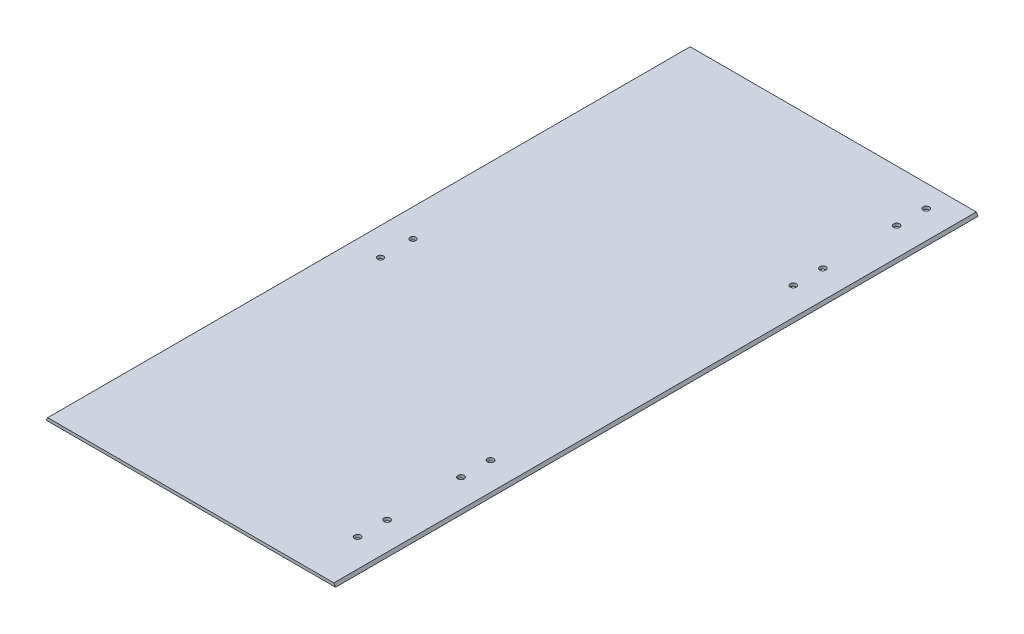
ISO-10303-21;
HEADER;
FILE_DESCRIPTION(('STEP AP214'),'2;1');
FILE_NAME('part.step','',(''),(''),'','','');
FILE_SCHEMA(('AUTOMOTIVE_DESIGN { 1 0 10303 214 1 1 1 1 }'));
ENDSEC;
DATA;
#1=APPLICATION_CONTEXT('core data for automotive mechanical design processes');
#2=APPLICATION_PROTOCOL_DEFINITION('international standard','automotive_design',2000,#1);
#3=PRODUCT_CONTEXT('',#1,'mechanical');
#4=PRODUCT('Part','Part','',(#3));
#5=PRODUCT_RELATED_PRODUCT_CATEGORY('part','',(#4));
#6=PRODUCT_DEFINITION_FORMATION('','',#4);
#7=PRODUCT_DEFINITION_CONTEXT('part definition',#1,'design');
#8=PRODUCT_DEFINITION('design','',#6,#7);
#9=PRODUCT_DEFINITION_SHAPE('','',#8);
#10=(LENGTH_UNIT() NAMED_UNIT(*) SI_UNIT(.MILLI.,.METRE.));
#11=(NAMED_UNIT(*) PLANE_ANGLE_UNIT() SI_UNIT($,.RADIAN.));
#12=(NAMED_UNIT(*) SI_UNIT($,.STERADIAN.) SOLID_ANGLE_UNIT());
#13=UNCERTAINTY_MEASURE_WITH_UNIT(LENGTH_MEASURE(1.E-05),#10,'distance_accuracy_value','');
#14=(GEOMETRIC_REPRESENTATION_CONTEXT(3) GLOBAL_UNCERTAINTY_ASSIGNED_CONTEXT((#13)) GLOBAL_UNIT_ASSIGNED_CONTEXT((#10,
#11,#12)) REPRESENTATION_CONTEXT('',''));
#15=CARTESIAN_POINT('',(0.,0.,0.));
#16=DIRECTION('',(0.,0.,1.));
#17=DIRECTION('',(1.,0.,0.));
#18=AXIS2_PLACEMENT_3D('',#15,#16,#17);
#19=CARTESIAN_POINT('',(-98.,-1.,-435.));
#20=DIRECTION('',(0.,-1.,0.));
#21=DIRECTION('',(0.,0.,-1.));
#22=AXIS2_PLACEMENT_3D('',#19,#20,#21);
#23=PLANE('',#22);
#24=CARTESIAN_POINT('',(-78.,-1.,-206.5));
#25=DIRECTION('',(0.,-1.,0.));
#26=DIRECTION('',(0.,0.,-1.));
#27=AXIS2_PLACEMENT_3D('',#24,#25,#26);
#28=CIRCLE('',#27,2.);
#29=CARTESIAN_POINT('',(-78.,-1.,-208.5));
#30=VERTEX_POINT('',#29);
#31=EDGE_CURVE('E184',#30,#30,#28,.T.);
#32=ORIENTED_EDGE('',*,*,#31,.F.);
#33=EDGE_LOOP('',(#32));
#34=FACE_BOUND('',#33,.T.);
#35=CARTESIAN_POINT('',(-78.,-1.,-228.5));
#36=DIRECTION('',(0.,-1.,0.));
#37=DIRECTION('',(0.,0.,1.));
#38=AXIS2_PLACEMENT_3D('',#35,#36,#37);
#39=CIRCLE('',#38,2.);
#40=CARTESIAN_POINT('',(-78.,-1.,-226.5));
#41=VERTEX_POINT('',#40);
#42=EDGE_CURVE('E185',#41,#41,#39,.T.);
#43=ORIENTED_EDGE('',*,*,#42,.F.);
#44=EDGE_LOOP('',(#43));
#45=FACE_BOUND('',#44,.T.);
#46=CARTESIAN_POINT('',(78.,-1.,-35.));
#47=DIRECTION('',(0.,-1.,0.));
#48=DIRECTION('',(0.,0.,-1.));
#49=AXIS2_PLACEMENT_3D('',#46,#47,#48);
#50=CIRCLE('',#49,2.1);
#51=CARTESIAN_POINT('',(78.,-1.,-37.1));
#52=VERTEX_POINT('',#51);
#53=EDGE_CURVE('E197',#52,#52,#50,.T.);
#54=ORIENTED_EDGE('',*,*,#53,.F.);
#55=EDGE_LOOP('',(#54));
#56=FACE_BOUND('',#55,.T.);
#57=CARTESIAN_POINT('',(78.,-1.,-55.));
#58=DIRECTION('',(0.,-1.,0.));
#59=DIRECTION('',(0.,0.,-1.));
#60=AXIS2_PLACEMENT_3D('',#57,#58,#59);
#61=CIRCLE('',#60,2.1);
#62=CARTESIAN_POINT('',(78.,-1.,-57.1));
#63=VERTEX_POINT('',#62);
#64=EDGE_CURVE('E200',#63,#63,#61,.T.);
#65=ORIENTED_EDGE('',*,*,#64,.F.);
#66=EDGE_LOOP('',(#65));
#67=FACE_BOUND('',#66,.T.);
#68=CARTESIAN_POINT('',(78.,-1.,-105.));
#69=DIRECTION('',(0.,-1.,0.));
#70=DIRECTION('',(0.,0.,-1.));
#71=AXIS2_PLACEMENT_3D('',#68,#69,#70);
#72=CIRCLE('',#71,2.1);
#73=CARTESIAN_POINT('',(78.,-1.,-107.1));
#74=VERTEX_POINT('',#73);
#75=EDGE_CURVE('E206',#74,#74,#72,.T.);
#76=ORIENTED_EDGE('',*,*,#75,.F.);
#77=EDGE_LOOP('',(#76));
#78=FACE_BOUND('',#77,.T.);
#79=CARTESIAN_POINT('',(78.,-1.,-125.));
#80=DIRECTION('',(0.,-1.,0.));
#81=DIRECTION('',(0.,0.,-1.));
#82=AXIS2_PLACEMENT_3D('',#79,#80,#81);
#83=CIRCLE('',#82,2.1);
#84=CARTESIAN_POINT('',(78.,-1.,-127.1));
#85=VERTEX_POINT('',#84);
#86=EDGE_CURVE('E212',#85,#85,#83,.T.);
#87=ORIENTED_EDGE('',*,*,#86,.F.);
#88=EDGE_LOOP('',(#87));
#89=FACE_BOUND('',#88,.T.);
#90=CARTESIAN_POINT('',(78.,-1.,-330.));
#91=DIRECTION('',(0.,-1.,0.));
#92=DIRECTION('',(0.,0.,-1.));
#93=AXIS2_PLACEMENT_3D('',#90,#91,#92);
#94=CIRCLE('',#93,2.1);
#95=CARTESIAN_POINT('',(78.,-1.,-332.1));
#96=VERTEX_POINT('',#95);
#97=EDGE_CURVE('E218',#96,#96,#94,.T.);
#98=ORIENTED_EDGE('',*,*,#97,.F.);
#99=EDGE_LOOP('',(#98));
#100=FACE_BOUND('',#99,.T.);
#101=CARTESIAN_POINT('',(78.,-1.,-350.));
#102=DIRECTION('',(0.,-1.,0.));
#103=DIRECTION('',(0.,0.,-1.));
#104=AXIS2_PLACEMENT_3D('',#101,#102,#103);
#105=CIRCLE('',#104,2.1);
#106=CARTESIAN_POINT('',(78.,-1.,-352.1));
#107=VERTEX_POINT('',#106);
#108=EDGE_CURVE('E224',#107,#107,#105,.T.);
#109=ORIENTED_EDGE('',*,*,#108,.F.);
#110=EDGE_LOOP('',(#109));
#111=FACE_BOUND('',#110,.T.);
#112=CARTESIAN_POINT('',(78.,-1.,-400.));
#113=DIRECTION('',(0.,-1.,0.));
#114=DIRECTION('',(0.,0.,-1.));
#115=AXIS2_PLACEMENT_3D('',#112,#113,#114);
#116=CIRCLE('',#115,2.1);
#117=CARTESIAN_POINT('',(78.,-1.,-402.1));
#118=VERTEX_POINT('',#117);
#119=EDGE_CURVE('E230',#118,#118,#116,.T.);
#120=ORIENTED_EDGE('',*,*,#119,.F.);
#121=EDGE_LOOP('',(#120));
#122=FACE_BOUND('',#121,.T.);
#123=CARTESIAN_POINT('',(78.,-1.,-420.));
#124=DIRECTION('',(0.,-1.,0.));
#125=DIRECTION('',(0.,0.,-1.));
#126=AXIS2_PLACEMENT_3D('',#123,#124,#125);
#127=CIRCLE('',#126,2.1);
#128=CARTESIAN_POINT('',(78.,-1.,-422.1));
#129=VERTEX_POINT('',#128);
#130=EDGE_CURVE('E236',#129,#129,#127,.T.);
#131=ORIENTED_EDGE('',*,*,#130,.F.);
#132=EDGE_LOOP('',(#131));
#133=FACE_BOUND('',#132,.T.);
#134=DIRECTION('',(1.,0.,0.));
#135=VECTOR('',#134,1.);
#136=CARTESIAN_POINT('',(-98.,-1.,0.));
#137=LINE('',#136,#135);
#138=CARTESIAN_POINT('',(-98.,-1.,0.));
#139=VERTEX_POINT('',#138);
#140=CARTESIAN_POINT('',(98.07,-1.,0.));
#141=VERTEX_POINT('',#140);
#142=EDGE_CURVE('E106',#139,#141,#137,.T.);
#143=ORIENTED_EDGE('',*,*,#142,.F.);
#144=DIRECTION('',(0.,0.,1.));
#145=VECTOR('',#144,1.);
#146=CARTESIAN_POINT('',(-98.,-1.,-435.));
#147=LINE('',#146,#145);
#148=CARTESIAN_POINT('',(-98.,-1.,-435.));
#149=VERTEX_POINT('',#148);
#150=EDGE_CURVE('E11',#149,#139,#147,.T.);
#151=ORIENTED_EDGE('',*,*,#150,.F.);
#152=DIRECTION('',(1.,0.,0.));
#153=VECTOR('',#152,1.);
#154=CARTESIAN_POINT('',(-98.,-1.,-435.));
#155=LINE('',#154,#153);
#156=CARTESIAN_POINT('',(98.07,-1.,-435.));
#157=VERTEX_POINT('',#156);
#158=EDGE_CURVE('E99',#149,#157,#155,.T.);
#159=ORIENTED_EDGE('',*,*,#158,.T.);
#160=DIRECTION('',(0.,0.,1.));
#161=VECTOR('',#160,1.);
#162=CARTESIAN_POINT('',(98.07,-1.,-435.));
#163=LINE('',#162,#161);
#164=EDGE_CURVE('E44',#157,#141,#163,.T.);
#165=ORIENTED_EDGE('',*,*,#164,.T.);
#166=EDGE_LOOP('',(#143,#151,#159,#165));
#167=FACE_BOUND('',#166,.T.);
#168=ADVANCED_FACE('F41',(#34,#45,#56,#67,#78,#89,#100,#111,#122,#133,#167),#23,.T.);
#169=CARTESIAN_POINT('',(-98.,-1.,-435.));
#170=DIRECTION('',(-0.866025403784441,0.499999999999996,0.));
#171=DIRECTION('',(-0.499999999999996,-0.866025403784441,0.));
#172=AXIS2_PLACEMENT_3D('',#169,#170,#171);
#173=PLANE('',#172);
#174=DIRECTION('',(-0.499999999999996,-0.866025403784441,0.));
#175=VECTOR('',#174,1.);
#176=CARTESIAN_POINT('',(-98.,-1.,0.));
#177=LINE('',#176,#175);
#178=CARTESIAN_POINT('',(-96.8452994616208,1.,0.));
#179=VERTEX_POINT('',#178);
#180=EDGE_CURVE('E101',#179,#139,#177,.T.);
#181=ORIENTED_EDGE('',*,*,#180,.F.);
#182=DIRECTION('',(0.,0.,1.));
#183=VECTOR('',#182,1.);
#184=CARTESIAN_POINT('',(-96.8452994616208,1.,-435.));
#185=LINE('',#184,#183);
#186=CARTESIAN_POINT('',(-96.8452994616208,1.,-435.));
#187=VERTEX_POINT('',#186);
#188=EDGE_CURVE('E50',#187,#179,#185,.T.);
#189=ORIENTED_EDGE('',*,*,#188,.F.);
#190=DIRECTION('',(-0.499999999999996,-0.866025403784441,0.));
#191=VECTOR('',#190,1.);
#192=CARTESIAN_POINT('',(-98.,-1.,-435.));
#193=LINE('',#192,#191);
#194=EDGE_CURVE('E96',#187,#149,#193,.T.);
#195=ORIENTED_EDGE('',*,*,#194,.T.);
#196=ORIENTED_EDGE('',*,*,#150,.T.);
#197=EDGE_LOOP('',(#181,#189,#195,#196));
#198=FACE_BOUND('',#197,.T.);
#199=ADVANCED_FACE('F117',(#198),#173,.T.);
#200=CARTESIAN_POINT('',(-96.8452994616208,1.,-435.));
#201=DIRECTION('',(0.,1.,0.));
#202=DIRECTION('',(0.,0.,1.));
#203=AXIS2_PLACEMENT_3D('',#200,#201,#202);
#204=PLANE('',#203);
#205=CARTESIAN_POINT('',(-78.,1.,-206.5));
#206=DIRECTION('',(0.,-1.,0.));
#207=DIRECTION('',(0.,0.,-1.));
#208=AXIS2_PLACEMENT_3D('',#205,#206,#207);
#209=CIRCLE('',#208,2.);
#210=CARTESIAN_POINT('',(-78.,1.,-208.5));
#211=VERTEX_POINT('',#210);
#212=EDGE_CURVE('E181',#211,#211,#209,.T.);
#213=ORIENTED_EDGE('',*,*,#212,.T.);
#214=EDGE_LOOP('',(#213));
#215=FACE_BOUND('',#214,.T.);
#216=CARTESIAN_POINT('',(-78.,1.,-228.5));
#217=DIRECTION('',(0.,-1.,0.));
#218=DIRECTION('',(0.,0.,1.));
#219=AXIS2_PLACEMENT_3D('',#216,#217,#218);
#220=CIRCLE('',#219,2.);
#221=CARTESIAN_POINT('',(-78.,1.,-226.5));
#222=VERTEX_POINT('',#221);
#223=EDGE_CURVE('E190',#222,#222,#220,.T.);
#224=ORIENTED_EDGE('',*,*,#223,.T.);
#225=EDGE_LOOP('',(#224));
#226=FACE_BOUND('',#225,.T.);
#227=CARTESIAN_POINT('',(78.,1.,-35.));
#228=DIRECTION('',(0.,-1.,0.));
#229=DIRECTION('',(0.,0.,-1.));
#230=AXIS2_PLACEMENT_3D('',#227,#228,#229);
#231=CIRCLE('',#230,2.1);
#232=CARTESIAN_POINT('',(78.,1.,-37.1));
#233=VERTEX_POINT('',#232);
#234=EDGE_CURVE('E110',#233,#233,#231,.T.);
#235=ORIENTED_EDGE('',*,*,#234,.T.);
#236=EDGE_LOOP('',(#235));
#237=FACE_BOUND('',#236,.T.);
#238=CARTESIAN_POINT('',(78.,1.,-55.));
#239=DIRECTION('',(0.,-1.,0.));
#240=DIRECTION('',(0.,0.,-1.));
#241=AXIS2_PLACEMENT_3D('',#238,#239,#240);
#242=CIRCLE('',#241,2.1);
#243=CARTESIAN_POINT('',(78.,1.,-57.1));
#244=VERTEX_POINT('',#243);
#245=EDGE_CURVE('E203',#244,#244,#242,.T.);
#246=ORIENTED_EDGE('',*,*,#245,.T.);
#247=EDGE_LOOP('',(#246));
#248=FACE_BOUND('',#247,.T.);
#249=CARTESIAN_POINT('',(78.,1.,-105.));
#250=DIRECTION('',(0.,-1.,0.));
#251=DIRECTION('',(0.,0.,-1.));
#252=AXIS2_PLACEMENT_3D('',#249,#250,#251);
#253=CIRCLE('',#252,2.1);
#254=CARTESIAN_POINT('',(78.,1.,-107.1));
#255=VERTEX_POINT('',#254);
#256=EDGE_CURVE('E209',#255,#255,#253,.T.);
#257=ORIENTED_EDGE('',*,*,#256,.T.);
#258=EDGE_LOOP('',(#257));
#259=FACE_BOUND('',#258,.T.);
#260=CARTESIAN_POINT('',(78.,1.,-125.));
#261=DIRECTION('',(0.,-1.,0.));
#262=DIRECTION('',(0.,0.,-1.));
#263=AXIS2_PLACEMENT_3D('',#260,#261,#262);
#264=CIRCLE('',#263,2.1);
#265=CARTESIAN_POINT('',(78.,1.,-127.1));
#266=VERTEX_POINT('',#265);
#267=EDGE_CURVE('E215',#266,#266,#264,.T.);
#268=ORIENTED_EDGE('',*,*,#267,.T.);
#269=EDGE_LOOP('',(#268));
#270=FACE_BOUND('',#269,.T.);
#271=CARTESIAN_POINT('',(78.,1.,-330.));
#272=DIRECTION('',(0.,-1.,0.));
#273=DIRECTION('',(0.,0.,-1.));
#274=AXIS2_PLACEMENT_3D('',#271,#272,#273);
#275=CIRCLE('',#274,2.1);
#276=CARTESIAN_POINT('',(78.,1.,-332.1));
#277=VERTEX_POINT('',#276);
#278=EDGE_CURVE('E221',#277,#277,#275,.T.);
#279=ORIENTED_EDGE('',*,*,#278,.T.);
#280=EDGE_LOOP('',(#279));
#281=FACE_BOUND('',#280,.T.);
#282=CARTESIAN_POINT('',(78.,1.,-350.));
#283=DIRECTION('',(0.,-1.,0.));
#284=DIRECTION('',(0.,0.,-1.));
#285=AXIS2_PLACEMENT_3D('',#282,#283,#284);
#286=CIRCLE('',#285,2.1);
#287=CARTESIAN_POINT('',(78.,1.,-352.1));
#288=VERTEX_POINT('',#287);
#289=EDGE_CURVE('E227',#288,#288,#286,.T.);
#290=ORIENTED_EDGE('',*,*,#289,.T.);
#291=EDGE_LOOP('',(#290));
#292=FACE_BOUND('',#291,.T.);
#293=CARTESIAN_POINT('',(78.,1.,-400.));
#294=DIRECTION('',(0.,-1.,0.));
#295=DIRECTION('',(0.,0.,-1.));
#296=AXIS2_PLACEMENT_3D('',#293,#294,#295);
#297=CIRCLE('',#296,2.1);
#298=CARTESIAN_POINT('',(78.,1.,-402.1));
#299=VERTEX_POINT('',#298);
#300=EDGE_CURVE('E233',#299,#299,#297,.T.);
#301=ORIENTED_EDGE('',*,*,#300,.T.);
#302=EDGE_LOOP('',(#301));
#303=FACE_BOUND('',#302,.T.);
#304=CARTESIAN_POINT('',(78.,1.,-420.));
#305=DIRECTION('',(0.,-1.,0.));
#306=DIRECTION('',(0.,0.,-1.));
#307=AXIS2_PLACEMENT_3D('',#304,#305,#306);
#308=CIRCLE('',#307,2.1);
#309=CARTESIAN_POINT('',(78.,1.,-422.1));
#310=VERTEX_POINT('',#309);
#311=EDGE_CURVE('E187',#310,#310,#308,.T.);
#312=ORIENTED_EDGE('',*,*,#311,.T.);
#313=EDGE_LOOP('',(#312));
#314=FACE_BOUND('',#313,.T.);
#315=DIRECTION('',(-1.,0.,0.));
#316=VECTOR('',#315,1.);
#317=CARTESIAN_POINT('',(-96.8452994616208,1.,0.));
#318=LINE('',#317,#316);
#319=CARTESIAN_POINT('',(96.9152994616207,1.,0.));
#320=VERTEX_POINT('',#319);
#321=EDGE_CURVE('E91',#320,#179,#318,.T.);
#322=ORIENTED_EDGE('',*,*,#321,.F.);
#323=DIRECTION('',(0.,0.,1.));
#324=VECTOR('',#323,1.);
#325=CARTESIAN_POINT('',(96.9152994616207,1.,-435.));
#326=LINE('',#325,#324);
#327=CARTESIAN_POINT('',(96.9152994616207,1.,-435.));
#328=VERTEX_POINT('',#327);
#329=EDGE_CURVE('E86',#328,#320,#326,.T.);
#330=ORIENTED_EDGE('',*,*,#329,.F.);
#331=DIRECTION('',(-1.,0.,0.));
#332=VECTOR('',#331,1.);
#333=CARTESIAN_POINT('',(-96.8452994616208,1.,-435.));
#334=LINE('',#333,#332);
#335=EDGE_CURVE('E89',#328,#187,#334,.T.);
#336=ORIENTED_EDGE('',*,*,#335,.T.);
#337=ORIENTED_EDGE('',*,*,#188,.T.);
#338=EDGE_LOOP('',(#322,#330,#336,#337));
#339=FACE_BOUND('',#338,.T.);
#340=ADVANCED_FACE('F88',(#215,#226,#237,#248,#259,#270,#281,#292,#303,#314,#339),#204,.T.);
#341=CARTESIAN_POINT('',(98.07,-1.,-435.));
#342=DIRECTION('',(0.866025403784441,0.499999999999996,0.));
#343=DIRECTION('',(-0.499999999999996,0.866025403784441,0.));
#344=AXIS2_PLACEMENT_3D('',#341,#342,#343);
#345=PLANE('',#344);
#346=DIRECTION('',(-0.499999999999996,0.866025403784441,0.));
#347=VECTOR('',#346,1.);
#348=CARTESIAN_POINT('',(98.07,-1.,0.));
#349=LINE('',#348,#347);
#350=EDGE_CURVE('E109',#141,#320,#349,.T.);
#351=ORIENTED_EDGE('',*,*,#350,.F.);
#352=ORIENTED_EDGE('',*,*,#164,.F.);
#353=DIRECTION('',(-0.499999999999996,0.866025403784441,0.));
#354=VECTOR('',#353,1.);
#355=CARTESIAN_POINT('',(98.07,-1.,-435.));
#356=LINE('',#355,#354);
#357=EDGE_CURVE('E95',#157,#328,#356,.T.);
#358=ORIENTED_EDGE('',*,*,#357,.T.);
#359=ORIENTED_EDGE('',*,*,#329,.T.);
#360=EDGE_LOOP('',(#351,#352,#358,#359));
#361=FACE_BOUND('',#360,.T.);
#362=ADVANCED_FACE('F98',(#361),#345,.T.);
#363=CARTESIAN_POINT('',(0.,0.,-435.));
#364=DIRECTION('',(0.,0.,1.));
#365=DIRECTION('',(1.,0.,0.));
#366=AXIS2_PLACEMENT_3D('',#363,#364,#365);
#367=PLANE('',#366);
#368=ORIENTED_EDGE('',*,*,#158,.F.);
#369=ORIENTED_EDGE('',*,*,#194,.F.);
#370=ORIENTED_EDGE('',*,*,#335,.F.);
#371=ORIENTED_EDGE('',*,*,#357,.F.);
#372=EDGE_LOOP('',(#368,#369,#370,#371));
#373=FACE_BOUND('',#372,.T.);
#374=ADVANCED_FACE('F94',(#373),#367,.F.);
#375=CARTESIAN_POINT('',(0.,0.,0.));
#376=DIRECTION('',(0.,0.,1.));
#377=DIRECTION('',(1.,0.,0.));
#378=AXIS2_PLACEMENT_3D('',#375,#376,#377);
#379=PLANE('',#378);
#380=ORIENTED_EDGE('',*,*,#142,.T.);
#381=ORIENTED_EDGE('',*,*,#350,.T.);
#382=ORIENTED_EDGE('',*,*,#321,.T.);
#383=ORIENTED_EDGE('',*,*,#180,.T.);
#384=EDGE_LOOP('',(#380,#381,#382,#383));
#385=FACE_BOUND('',#384,.T.);
#386=ADVANCED_FACE('F116',(#385),#379,.T.);
#387=CARTESIAN_POINT('',(78.,1.,-420.));
#388=DIRECTION('',(0.,-1.,0.));
#389=DIRECTION('',(0.,0.,-1.));
#390=AXIS2_PLACEMENT_3D('',#387,#388,#389);
#391=CYLINDRICAL_SURFACE('',#390,2.1);
#392=ORIENTED_EDGE('',*,*,#311,.F.);
#393=EDGE_LOOP('',(#392));
#394=FACE_BOUND('',#393,.T.);
#395=ORIENTED_EDGE('',*,*,#130,.T.);
#396=EDGE_LOOP('',(#395));
#397=FACE_BOUND('',#396,.T.);
#398=ADVANCED_FACE('F136',(#394,#397),#391,.F.);
#399=CARTESIAN_POINT('',(78.,1.,-400.));
#400=DIRECTION('',(0.,-1.,0.));
#401=DIRECTION('',(0.,0.,-1.));
#402=AXIS2_PLACEMENT_3D('',#399,#400,#401);
#403=CYLINDRICAL_SURFACE('',#402,2.1);
#404=ORIENTED_EDGE('',*,*,#300,.F.);
#405=EDGE_LOOP('',(#404));
#406=FACE_BOUND('',#405,.T.);
#407=ORIENTED_EDGE('',*,*,#119,.T.);
#408=EDGE_LOOP('',(#407));
#409=FACE_BOUND('',#408,.T.);
#410=ADVANCED_FACE('F140',(#406,#409),#403,.F.);
#411=CARTESIAN_POINT('',(78.,1.,-350.));
#412=DIRECTION('',(0.,-1.,0.));
#413=DIRECTION('',(0.,0.,-1.));
#414=AXIS2_PLACEMENT_3D('',#411,#412,#413);
#415=CYLINDRICAL_SURFACE('',#414,2.1);
#416=ORIENTED_EDGE('',*,*,#289,.F.);
#417=EDGE_LOOP('',(#416));
#418=FACE_BOUND('',#417,.T.);
#419=ORIENTED_EDGE('',*,*,#108,.T.);
#420=EDGE_LOOP('',(#419));
#421=FACE_BOUND('',#420,.T.);
#422=ADVANCED_FACE('F144',(#418,#421),#415,.F.);
#423=CARTESIAN_POINT('',(78.,1.,-330.));
#424=DIRECTION('',(0.,-1.,0.));
#425=DIRECTION('',(0.,0.,-1.));
#426=AXIS2_PLACEMENT_3D('',#423,#424,#425);
#427=CYLINDRICAL_SURFACE('',#426,2.1);
#428=ORIENTED_EDGE('',*,*,#278,.F.);
#429=EDGE_LOOP('',(#428));
#430=FACE_BOUND('',#429,.T.);
#431=ORIENTED_EDGE('',*,*,#97,.T.);
#432=EDGE_LOOP('',(#431));
#433=FACE_BOUND('',#432,.T.);
#434=ADVANCED_FACE('F148',(#430,#433),#427,.F.);
#435=CARTESIAN_POINT('',(78.,1.,-125.));
#436=DIRECTION('',(0.,-1.,0.));
#437=DIRECTION('',(0.,0.,-1.));
#438=AXIS2_PLACEMENT_3D('',#435,#436,#437);
#439=CYLINDRICAL_SURFACE('',#438,2.1);
#440=ORIENTED_EDGE('',*,*,#267,.F.);
#441=EDGE_LOOP('',(#440));
#442=FACE_BOUND('',#441,.T.);
#443=ORIENTED_EDGE('',*,*,#86,.T.);
#444=EDGE_LOOP('',(#443));
#445=FACE_BOUND('',#444,.T.);
#446=ADVANCED_FACE('F152',(#442,#445),#439,.F.);
#447=CARTESIAN_POINT('',(78.,1.,-105.));
#448=DIRECTION('',(0.,-1.,0.));
#449=DIRECTION('',(0.,0.,-1.));
#450=AXIS2_PLACEMENT_3D('',#447,#448,#449);
#451=CYLINDRICAL_SURFACE('',#450,2.1);
#452=ORIENTED_EDGE('',*,*,#256,.F.);
#453=EDGE_LOOP('',(#452));
#454=FACE_BOUND('',#453,.T.);
#455=ORIENTED_EDGE('',*,*,#75,.T.);
#456=EDGE_LOOP('',(#455));
#457=FACE_BOUND('',#456,.T.);
#458=ADVANCED_FACE('F156',(#454,#457),#451,.F.);
#459=CARTESIAN_POINT('',(78.,1.,-55.));
#460=DIRECTION('',(0.,-1.,0.));
#461=DIRECTION('',(0.,0.,-1.));
#462=AXIS2_PLACEMENT_3D('',#459,#460,#461);
#463=CYLINDRICAL_SURFACE('',#462,2.1);
#464=ORIENTED_EDGE('',*,*,#245,.F.);
#465=EDGE_LOOP('',(#464));
#466=FACE_BOUND('',#465,.T.);
#467=ORIENTED_EDGE('',*,*,#64,.T.);
#468=EDGE_LOOP('',(#467));
#469=FACE_BOUND('',#468,.T.);
#470=ADVANCED_FACE('F160',(#466,#469),#463,.F.);
#471=CARTESIAN_POINT('',(78.,1.,-35.));
#472=DIRECTION('',(0.,-1.,0.));
#473=DIRECTION('',(0.,0.,-1.));
#474=AXIS2_PLACEMENT_3D('',#471,#472,#473);
#475=CYLINDRICAL_SURFACE('',#474,2.1);
#476=ORIENTED_EDGE('',*,*,#234,.F.);
#477=EDGE_LOOP('',(#476));
#478=FACE_BOUND('',#477,.T.);
#479=ORIENTED_EDGE('',*,*,#53,.T.);
#480=EDGE_LOOP('',(#479));
#481=FACE_BOUND('',#480,.T.);
#482=ADVANCED_FACE('F164',(#478,#481),#475,.F.);
#483=CARTESIAN_POINT('',(-78.,1.,-228.5));
#484=DIRECTION('',(0.,-1.,0.));
#485=DIRECTION('',(0.,0.,-1.));
#486=AXIS2_PLACEMENT_3D('',#483,#484,#485);
#487=CYLINDRICAL_SURFACE('',#486,2.);
#488=ORIENTED_EDGE('',*,*,#223,.F.);
#489=EDGE_LOOP('',(#488));
#490=FACE_BOUND('',#489,.T.);
#491=ORIENTED_EDGE('',*,*,#42,.T.);
#492=EDGE_LOOP('',(#491));
#493=FACE_BOUND('',#492,.T.);
#494=ADVANCED_FACE('F168',(#490,#493),#487,.F.);
#495=CARTESIAN_POINT('',(-78.,1.,-206.5));
#496=DIRECTION('',(0.,-1.,0.));
#497=DIRECTION('',(0.,0.,-1.));
#498=AXIS2_PLACEMENT_3D('',#495,#496,#497);
#499=CYLINDRICAL_SURFACE('',#498,2.);
#500=ORIENTED_EDGE('',*,*,#212,.F.);
#501=EDGE_LOOP('',(#500));
#502=FACE_BOUND('',#501,.T.);
#503=ORIENTED_EDGE('',*,*,#31,.T.);
#504=EDGE_LOOP('',(#503));
#505=FACE_BOUND('',#504,.T.);
#506=ADVANCED_FACE('F172',(#502,#505),#499,.F.);
#507=CLOSED_SHELL('',(#168,#199,#340,#362,#374,#386,#398,#410,#422,#434,#446,#458,#470,#482,
#494,#506));
#508=MANIFOLD_SOLID_BREP('B2',#507);
#509=ADVANCED_BREP_SHAPE_REPRESENTATION('',(#18,#508),#14);
#510=SHAPE_DEFINITION_REPRESENTATION(#9,#509);
ENDSEC;
END-ISO-10303-21;
